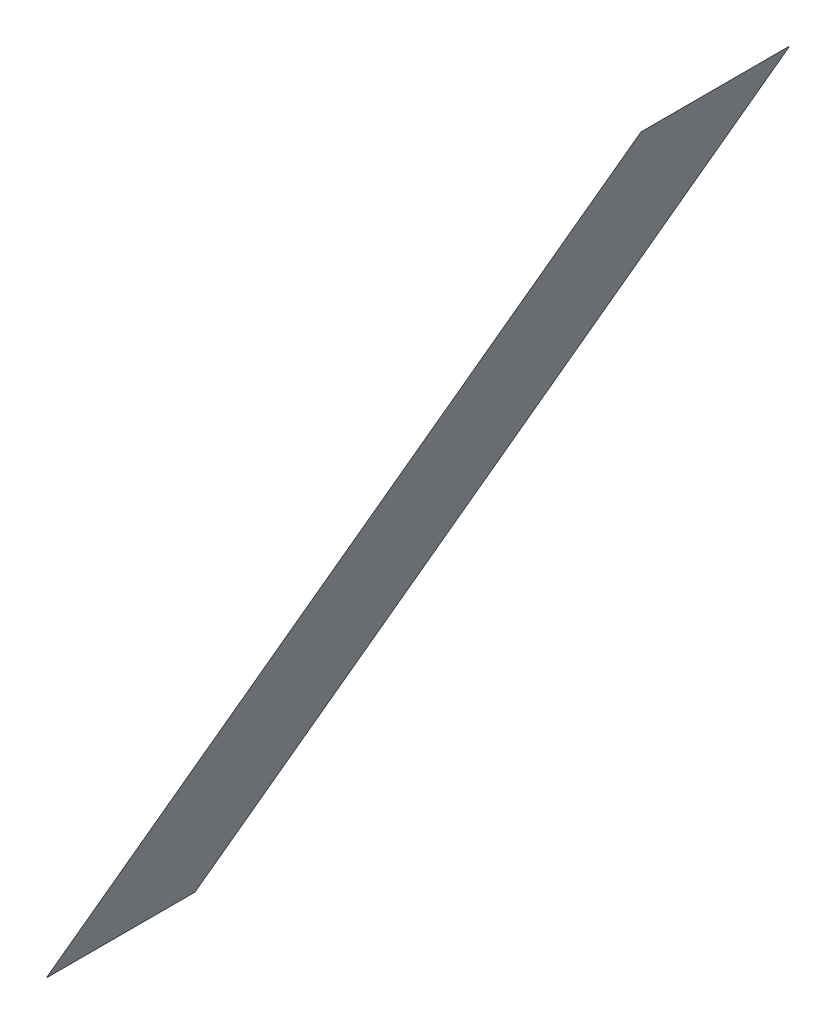
ISO-10303-21;
HEADER;
FILE_DESCRIPTION(('STEP AP214'),'2;1');
FILE_NAME('part.step','',(''),(''),'','','');
FILE_SCHEMA(('AUTOMOTIVE_DESIGN { 1 0 10303 214 1 1 1 1 }'));
ENDSEC;
DATA;
#1=APPLICATION_CONTEXT('core data for automotive mechanical design processes');
#2=APPLICATION_PROTOCOL_DEFINITION('international standard','automotive_design',2000,#1);
#3=PRODUCT_CONTEXT('',#1,'mechanical');
#4=PRODUCT('Part','Part','',(#3));
#5=PRODUCT_RELATED_PRODUCT_CATEGORY('part','',(#4));
#6=PRODUCT_DEFINITION_FORMATION('','',#4);
#7=PRODUCT_DEFINITION_CONTEXT('part definition',#1,'design');
#8=PRODUCT_DEFINITION('design','',#6,#7);
#9=PRODUCT_DEFINITION_SHAPE('','',#8);
#10=(LENGTH_UNIT() NAMED_UNIT(*) SI_UNIT(.MILLI.,.METRE.));
#11=(NAMED_UNIT(*) PLANE_ANGLE_UNIT() SI_UNIT($,.RADIAN.));
#12=(NAMED_UNIT(*) SI_UNIT($,.STERADIAN.) SOLID_ANGLE_UNIT());
#13=UNCERTAINTY_MEASURE_WITH_UNIT(LENGTH_MEASURE(1.E-05),#10,'distance_accuracy_value','');
#14=(GEOMETRIC_REPRESENTATION_CONTEXT(3) GLOBAL_UNCERTAINTY_ASSIGNED_CONTEXT((#13)) GLOBAL_UNIT_ASSIGNED_CONTEXT((#10,
#11,#12)) REPRESENTATION_CONTEXT('',''));
#15=CARTESIAN_POINT('',(0.,0.,0.));
#16=DIRECTION('',(0.,0.,1.));
#17=DIRECTION('',(1.,0.,0.));
#18=AXIS2_PLACEMENT_3D('',#15,#16,#17);
#19=CARTESIAN_POINT('',(153.24224401775,-36.5766517883406,-265.));
#20=DIRECTION('',(0.,0.,1.));
#21=DIRECTION('',(1.,0.,0.));
#22=AXIS2_PLACEMENT_3D('',#19,#20,#21);
#23=PLANE('',#22);
#24=DIRECTION('',(-0.499999988947861,-0.866025410165394,0.));
#25=VECTOR('',#24,1.);
#26=CARTESIAN_POINT('',(138.830656796325,-53.5383544875833,-265.));
#27=LINE('',#26,#25);
#28=CARTESIAN_POINT('',(159.778185853143,-17.2561687988277,-265.));
#29=VERTEX_POINT('',#28);
#30=CARTESIAN_POINT('',(139.778186295229,-51.8971852054435,-265.));
#31=VERTEX_POINT('',#30);
#32=EDGE_CURVE('E102',#29,#31,#27,.T.);
#33=ORIENTED_EDGE('',*,*,#32,.T.);
#34=DIRECTION('',(0.866025403784439,-0.5,0.));
#35=VECTOR('',#34,1.);
#36=CARTESIAN_POINT('',(139.778144274748,-51.8971609449076,-265.));
#37=LINE('',#36,#35);
#38=CARTESIAN_POINT('',(139.778144274748,-51.8971609449076,-265.));
#39=VERTEX_POINT('',#38);
#40=EDGE_CURVE('E131',#39,#31,#37,.T.);
#41=ORIENTED_EDGE('',*,*,#40,.F.);
#42=DIRECTION('',(-0.5,-0.866025403784439,0.));
#43=VECTOR('',#42,1.);
#44=CARTESIAN_POINT('',(159.778144274748,-17.2561447935301,-265.));
#45=LINE('',#44,#43);
#46=CARTESIAN_POINT('',(159.778144274748,-17.2561447935301,-265.));
#47=VERTEX_POINT('',#46);
#48=EDGE_CURVE('E104',#47,#39,#45,.T.);
#49=ORIENTED_EDGE('',*,*,#48,.F.);
#50=DIRECTION('',(-0.866025403784439,0.5,0.));
#51=VECTOR('',#50,1.);
#52=CARTESIAN_POINT('',(166.706343760751,-21.2561426317736,-265.));
#53=LINE('',#52,#51);
#54=EDGE_CURVE('E51',#29,#47,#53,.T.);
#55=ORIENTED_EDGE('',*,*,#54,.F.);
#56=EDGE_LOOP('',(#33,#41,#49,#55));
#57=FACE_BOUND('',#56,.T.);
#58=ADVANCED_FACE('F48',(#57),#23,.F.);
#59=CARTESIAN_POINT('',(153.24224401775,-36.5766517883406,-260.));
#60=DIRECTION('',(0.,0.,1.));
#61=DIRECTION('',(1.,0.,0.));
#62=AXIS2_PLACEMENT_3D('',#59,#60,#61);
#63=PLANE('',#62);
#64=DIRECTION('',(-0.499999988947861,-0.866025410165394,0.));
#65=VECTOR('',#64,1.);
#66=CARTESIAN_POINT('',(172.179452182066,4.22345519411566,-260.));
#67=LINE('',#66,#65);
#68=CARTESIAN_POINT('',(159.778185853143,-17.2561687988278,-260.));
#69=VERTEX_POINT('',#68);
#70=CARTESIAN_POINT('',(139.778186295229,-51.8971852054435,-260.));
#71=VERTEX_POINT('',#70);
#72=EDGE_CURVE('E119',#69,#71,#67,.T.);
#73=ORIENTED_EDGE('',*,*,#72,.F.);
#74=DIRECTION('',(-0.866025403784439,0.5,0.));
#75=VECTOR('',#74,1.);
#76=CARTESIAN_POINT('',(166.706343760751,-21.2561426317736,-260.));
#77=LINE('',#76,#75);
#78=CARTESIAN_POINT('',(159.778144274748,-17.2561447935301,-260.));
#79=VERTEX_POINT('',#78);
#80=EDGE_CURVE('E11',#69,#79,#77,.T.);
#81=ORIENTED_EDGE('',*,*,#80,.T.);
#82=DIRECTION('',(-0.5,-0.866025403784439,0.));
#83=VECTOR('',#82,1.);
#84=CARTESIAN_POINT('',(159.778144274748,-17.2561447935301,-260.));
#85=LINE('',#84,#83);
#86=CARTESIAN_POINT('',(139.778144274748,-51.8971609449076,-260.));
#87=VERTEX_POINT('',#86);
#88=EDGE_CURVE('E138',#79,#87,#85,.T.);
#89=ORIENTED_EDGE('',*,*,#88,.T.);
#90=DIRECTION('',(0.866025403784439,-0.5,0.));
#91=VECTOR('',#90,1.);
#92=CARTESIAN_POINT('',(139.778144274748,-51.8971609449076,-260.));
#93=LINE('',#92,#91);
#94=EDGE_CURVE('E115',#87,#71,#93,.T.);
#95=ORIENTED_EDGE('',*,*,#94,.T.);
#96=EDGE_LOOP('',(#73,#81,#89,#95));
#97=FACE_BOUND('',#96,.T.);
#98=ADVANCED_FACE('F143',(#97),#63,.T.);
#99=CARTESIAN_POINT('',(166.706343760751,-21.2561426317736,-265.));
#100=DIRECTION('',(0.5,0.866025403784438,0.));
#101=DIRECTION('',(0.,0.,-1.));
#102=AXIS2_PLACEMENT_3D('',#99,#100,#101);
#103=PLANE('',#102);
#104=DIRECTION('',(0.,0.,-1.));
#105=VECTOR('',#104,1.);
#106=CARTESIAN_POINT('',(159.778185853143,-17.2561687988277,-163.75));
#107=LINE('',#106,#105);
#108=EDGE_CURVE('E111',#69,#29,#107,.T.);
#109=ORIENTED_EDGE('',*,*,#108,.T.);
#110=ORIENTED_EDGE('',*,*,#54,.T.);
#111=DIRECTION('',(0.,0.,1.));
#112=VECTOR('',#111,1.);
#113=CARTESIAN_POINT('',(159.778144274748,-17.2561447935301,-265.));
#114=LINE('',#113,#112);
#115=EDGE_CURVE('E106',#47,#79,#114,.T.);
#116=ORIENTED_EDGE('',*,*,#115,.T.);
#117=ORIENTED_EDGE('',*,*,#80,.F.);
#118=EDGE_LOOP('',(#109,#110,#116,#117));
#119=FACE_BOUND('',#118,.T.);
#120=ADVANCED_FACE('F117',(#119),#103,.T.);
#121=CARTESIAN_POINT('',(159.778144274748,-17.2561447935301,-265.));
#122=DIRECTION('',(-0.866025403784438,0.5,0.));
#123=DIRECTION('',(0.,0.,1.));
#124=AXIS2_PLACEMENT_3D('',#121,#122,#123);
#125=PLANE('',#124);
#126=ORIENTED_EDGE('',*,*,#48,.T.);
#127=DIRECTION('',(0.,0.,1.));
#128=VECTOR('',#127,1.);
#129=CARTESIAN_POINT('',(139.778144274748,-51.8971609449076,-265.));
#130=LINE('',#129,#128);
#131=EDGE_CURVE('E127',#39,#87,#130,.T.);
#132=ORIENTED_EDGE('',*,*,#131,.T.);
#133=ORIENTED_EDGE('',*,*,#88,.F.);
#134=ORIENTED_EDGE('',*,*,#115,.F.);
#135=EDGE_LOOP('',(#126,#132,#133,#134));
#136=FACE_BOUND('',#135,.T.);
#137=ADVANCED_FACE('F147',(#136),#125,.T.);
#138=CARTESIAN_POINT('',(139.778144274748,-51.8971609449076,-265.));
#139=DIRECTION('',(-0.5,-0.866025403784438,0.));
#140=DIRECTION('',(-0.866025403784438,0.5,0.));
#141=AXIS2_PLACEMENT_3D('',#138,#139,#140);
#142=PLANE('',#141);
#143=DIRECTION('',(0.,0.,1.));
#144=VECTOR('',#143,1.);
#145=CARTESIAN_POINT('',(139.778186295229,-51.8971852054435,-163.75));
#146=LINE('',#145,#144);
#147=EDGE_CURVE('E113',#31,#71,#146,.T.);
#148=ORIENTED_EDGE('',*,*,#147,.T.);
#149=ORIENTED_EDGE('',*,*,#94,.F.);
#150=ORIENTED_EDGE('',*,*,#131,.F.);
#151=ORIENTED_EDGE('',*,*,#40,.T.);
#152=EDGE_LOOP('',(#148,#149,#150,#151));
#153=FACE_BOUND('',#152,.T.);
#154=ADVANCED_FACE('F149',(#153),#142,.T.);
#155=CARTESIAN_POINT('',(127.883127543988,-72.5000319288229,-62.5));
#156=DIRECTION('',(-0.866025410165394,0.499999988947861,0.));
#157=DIRECTION('',(0.,0.,1.));
#158=AXIS2_PLACEMENT_3D('',#155,#156,#157);
#159=PLANE('',#158);
#160=ORIENTED_EDGE('',*,*,#108,.F.);
#161=ORIENTED_EDGE('',*,*,#72,.T.);
#162=ORIENTED_EDGE('',*,*,#147,.F.);
#163=ORIENTED_EDGE('',*,*,#32,.F.);
#164=EDGE_LOOP('',(#160,#161,#162,#163));
#165=FACE_BOUND('',#164,.T.);
#166=ADVANCED_FACE('F109',(#165),#159,.F.);
#167=CLOSED_SHELL('',(#58,#98,#120,#137,#154,#166));
#168=MANIFOLD_SOLID_BREP('B2',#167);
#169=ADVANCED_BREP_SHAPE_REPRESENTATION('',(#18,#168),#14);
#170=SHAPE_DEFINITION_REPRESENTATION(#9,#169);
ENDSEC;
END-ISO-10303-21;
